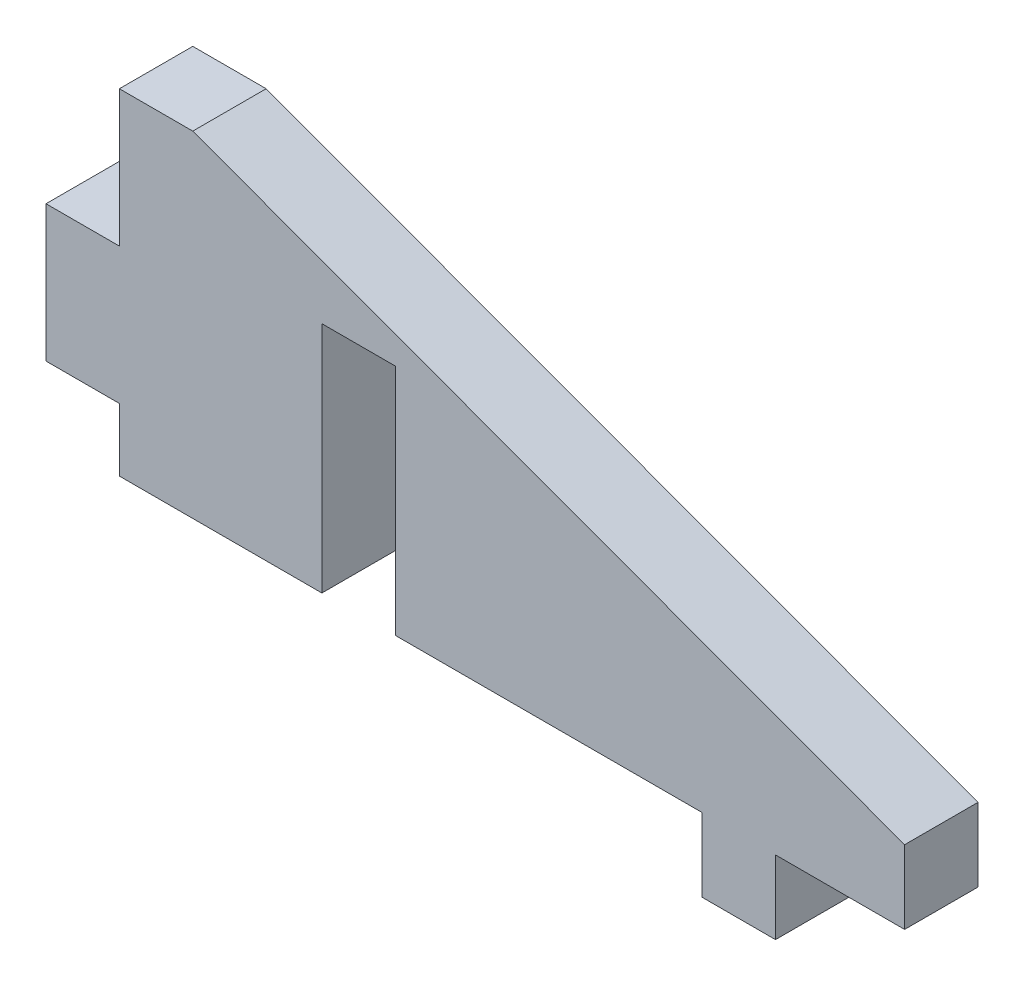
ISO-10303-21;
HEADER;
FILE_DESCRIPTION(('STEP AP214'),'2;1');
FILE_NAME('part.step','',(''),(''),'','','');
FILE_SCHEMA(('AUTOMOTIVE_DESIGN { 1 0 10303 214 1 1 1 1 }'));
ENDSEC;
DATA;
#1=APPLICATION_CONTEXT('core data for automotive mechanical design processes');
#2=APPLICATION_PROTOCOL_DEFINITION('international standard','automotive_design',2000,#1);
#3=PRODUCT_CONTEXT('',#1,'mechanical');
#4=PRODUCT('Part','Part','',(#3));
#5=PRODUCT_RELATED_PRODUCT_CATEGORY('part','',(#4));
#6=PRODUCT_DEFINITION_FORMATION('','',#4);
#7=PRODUCT_DEFINITION_CONTEXT('part definition',#1,'design');
#8=PRODUCT_DEFINITION('design','',#6,#7);
#9=PRODUCT_DEFINITION_SHAPE('','',#8);
#10=(LENGTH_UNIT() NAMED_UNIT(*) SI_UNIT(.MILLI.,.METRE.));
#11=(NAMED_UNIT(*) PLANE_ANGLE_UNIT() SI_UNIT($,.RADIAN.));
#12=(NAMED_UNIT(*) SI_UNIT($,.STERADIAN.) SOLID_ANGLE_UNIT());
#13=UNCERTAINTY_MEASURE_WITH_UNIT(LENGTH_MEASURE(1.E-05),#10,'distance_accuracy_value','');
#14=(GEOMETRIC_REPRESENTATION_CONTEXT(3) GLOBAL_UNCERTAINTY_ASSIGNED_CONTEXT((#13)) GLOBAL_UNIT_ASSIGNED_CONTEXT((#10,
#11,#12)) REPRESENTATION_CONTEXT('',''));
#15=CARTESIAN_POINT('',(0.,0.,0.));
#16=DIRECTION('',(0.,0.,1.));
#17=DIRECTION('',(1.,0.,0.));
#18=AXIS2_PLACEMENT_3D('',#15,#16,#17);
#19=CARTESIAN_POINT('',(0.,-12.7,4.5593));
#20=DIRECTION('',(0.,1.,0.));
#21=DIRECTION('',(0.,0.,1.));
#22=AXIS2_PLACEMENT_3D('',#19,#20,#21);
#23=PLANE('',#22);
#24=DIRECTION('',(0.,0.,1.));
#25=VECTOR('',#24,1.);
#26=CARTESIAN_POINT('',(18.6486799999997,-12.7,-15.6146500000006));
#27=LINE('',#26,#25);
#28=CARTESIAN_POINT('',(18.6486799999996,-12.7,-8.84708972748172E-13));
#29=VERTEX_POINT('',#28);
#30=CARTESIAN_POINT('',(18.6486799999996,-12.6999999999999,4.55929999999911));
#31=VERTEX_POINT('',#30);
#32=EDGE_CURVE('E326',#29,#31,#27,.T.);
#33=ORIENTED_EDGE('',*,*,#32,.T.);
#34=DIRECTION('',(1.,0.,0.));
#35=VECTOR('',#34,1.);
#36=CARTESIAN_POINT('',(0.,-12.7,4.5593));
#37=LINE('',#36,#35);
#38=CARTESIAN_POINT('',(14.0893799999996,-12.7,4.55929999999908));
#39=VERTEX_POINT('',#38);
#40=EDGE_CURVE('E177',#39,#31,#37,.T.);
#41=ORIENTED_EDGE('',*,*,#40,.F.);
#42=DIRECTION('',(0.,0.,1.));
#43=VECTOR('',#42,1.);
#44=CARTESIAN_POINT('',(14.0893799999997,-12.7,-15.6146500000007));
#45=LINE('',#44,#43);
#46=CARTESIAN_POINT('',(14.0893799999996,-12.7,-9.15933995315754E-13));
#47=VERTEX_POINT('',#46);
#48=EDGE_CURVE('E327',#47,#39,#45,.T.);
#49=ORIENTED_EDGE('',*,*,#48,.F.);
#50=DIRECTION('',(1.,0.,0.));
#51=VECTOR('',#50,1.);
#52=CARTESIAN_POINT('',(0.,-12.7,0.));
#53=LINE('',#52,#51);
#54=EDGE_CURVE('E232',#47,#29,#53,.T.);
#55=ORIENTED_EDGE('',*,*,#54,.T.);
#56=EDGE_LOOP('',(#33,#41,#49,#55));
#57=FACE_BOUND('',#56,.T.);
#58=ADVANCED_FACE('F35',(#57),#23,.F.);
#59=CARTESIAN_POINT('',(0.,0.,4.5593));
#60=DIRECTION('',(0.,0.,1.));
#61=DIRECTION('',(1.,0.,0.));
#62=AXIS2_PLACEMENT_3D('',#59,#60,#61);
#63=PLANE('',#62);
#64=DIRECTION('',(0.,1.,0.));
#65=VECTOR('',#64,1.);
#66=CARTESIAN_POINT('',(-4.97077999999975,0.,4.5593));
#67=LINE('',#66,#65);
#68=CARTESIAN_POINT('',(-4.97077999999975,-8.14069999999996,4.5593));
#69=VERTEX_POINT('',#68);
#70=CARTESIAN_POINT('',(-4.97077999999976,6.35000000000001,4.55929999999999));
#71=VERTEX_POINT('',#70);
#72=EDGE_CURVE('E199',#69,#71,#67,.T.);
#73=ORIENTED_EDGE('',*,*,#72,.F.);
#74=DIRECTION('',(-1.,0.,0.));
#75=VECTOR('',#74,1.);
#76=CARTESIAN_POINT('',(0.,-8.14069999999996,4.5593));
#77=LINE('',#76,#75);
#78=CARTESIAN_POINT('',(14.0893799999996,-8.14069999999995,4.55929999999908));
#79=VERTEX_POINT('',#78);
#80=EDGE_CURVE('E58',#79,#69,#77,.T.);
#81=ORIENTED_EDGE('',*,*,#80,.F.);
#82=DIRECTION('',(0.,-1.,0.));
#83=VECTOR('',#82,1.);
#84=CARTESIAN_POINT('',(14.0893799999996,-8.14069999999995,4.55929999999908));
#85=LINE('',#84,#83);
#86=EDGE_CURVE('E178',#79,#39,#85,.T.);
#87=ORIENTED_EDGE('',*,*,#86,.T.);
#88=ORIENTED_EDGE('',*,*,#40,.T.);
#89=DIRECTION('',(0.,-1.,0.));
#90=VECTOR('',#89,1.);
#91=CARTESIAN_POINT('',(18.6486799999996,-8.14069999999995,4.55929999999911));
#92=LINE('',#91,#90);
#93=CARTESIAN_POINT('',(18.6486799999996,-8.14069999999995,4.55929999999911));
#94=VERTEX_POINT('',#93);
#95=EDGE_CURVE('E167',#94,#31,#92,.T.);
#96=ORIENTED_EDGE('',*,*,#95,.F.);
#97=CARTESIAN_POINT('',(26.67,-8.14069999999995,4.5593));
#98=VERTEX_POINT('',#97);
#99=EDGE_CURVE('E155',#98,#94,#77,.T.);
#100=ORIENTED_EDGE('',*,*,#99,.F.);
#101=DIRECTION('',(0.,1.,0.));
#102=VECTOR('',#101,1.);
#103=CARTESIAN_POINT('',(26.67,0.,4.5593));
#104=LINE('',#103,#102);
#105=CARTESIAN_POINT('',(26.67,-3.5814,4.5593));
#106=VERTEX_POINT('',#105);
#107=EDGE_CURVE('E213',#98,#106,#104,.T.);
#108=ORIENTED_EDGE('',*,*,#107,.T.);
#109=DIRECTION('',(-0.938416716441645,0.345505522825442,0.));
#110=VECTOR('',#109,1.);
#111=CARTESIAN_POINT('',(2.02251562236887,5.49329126137941,4.5593));
#112=LINE('',#111,#110);
#113=CARTESIAN_POINT('',(-17.5514,12.7,4.5593));
#114=VERTEX_POINT('',#113);
#115=EDGE_CURVE('E215',#106,#114,#112,.T.);
#116=ORIENTED_EDGE('',*,*,#115,.T.);
#117=DIRECTION('',(-1.,0.,0.));
#118=VECTOR('',#117,1.);
#119=CARTESIAN_POINT('',(0.,12.7,4.5593));
#120=LINE('',#119,#118);
#121=CARTESIAN_POINT('',(-22.1107,12.7,4.5593));
#122=VERTEX_POINT('',#121);
#123=EDGE_CURVE('E217',#114,#122,#120,.T.);
#124=ORIENTED_EDGE('',*,*,#123,.T.);
#125=DIRECTION('',(0.,-1.,0.));
#126=VECTOR('',#125,1.);
#127=CARTESIAN_POINT('',(-22.1107,0.,4.5593));
#128=LINE('',#127,#126);
#129=CARTESIAN_POINT('',(-22.1107,4.23333333333333,4.5593));
#130=VERTEX_POINT('',#129);
#131=EDGE_CURVE('E219',#122,#130,#128,.T.);
#132=ORIENTED_EDGE('',*,*,#131,.T.);
#133=DIRECTION('',(1.,0.,0.));
#134=VECTOR('',#133,1.);
#135=CARTESIAN_POINT('',(0.,4.23333333333333,4.5593));
#136=LINE('',#135,#134);
#137=CARTESIAN_POINT('',(-26.67,4.23333333333333,4.5593));
#138=VERTEX_POINT('',#137);
#139=EDGE_CURVE('E221',#138,#130,#136,.T.);
#140=ORIENTED_EDGE('',*,*,#139,.F.);
#141=DIRECTION('',(0.,-1.,0.));
#142=VECTOR('',#141,1.);
#143=CARTESIAN_POINT('',(-26.67,0.,4.5593));
#144=LINE('',#143,#142);
#145=CARTESIAN_POINT('',(-26.67,-4.23333333333334,4.5593));
#146=VERTEX_POINT('',#145);
#147=EDGE_CURVE('E224',#138,#146,#144,.T.);
#148=ORIENTED_EDGE('',*,*,#147,.T.);
#149=DIRECTION('',(-1.,0.,0.));
#150=VECTOR('',#149,1.);
#151=CARTESIAN_POINT('',(0.,-4.23333333333333,4.5593));
#152=LINE('',#151,#150);
#153=CARTESIAN_POINT('',(-22.1107,-4.23333333333334,4.5593));
#154=VERTEX_POINT('',#153);
#155=EDGE_CURVE('E205',#154,#146,#152,.T.);
#156=ORIENTED_EDGE('',*,*,#155,.F.);
#157=DIRECTION('',(0.,-1.,0.));
#158=VECTOR('',#157,1.);
#159=CARTESIAN_POINT('',(-22.1107,0.,4.5593));
#160=LINE('',#159,#158);
#161=CARTESIAN_POINT('',(-22.1107,-8.14069999999996,4.5593));
#162=VERTEX_POINT('',#161);
#163=EDGE_CURVE('E208',#154,#162,#160,.T.);
#164=ORIENTED_EDGE('',*,*,#163,.T.);
#165=CARTESIAN_POINT('',(-9.53008000000039,-8.14069999999996,4.55929999999891));
#166=VERTEX_POINT('',#165);
#167=EDGE_CURVE('E164',#166,#162,#77,.T.);
#168=ORIENTED_EDGE('',*,*,#167,.F.);
#169=DIRECTION('',(0.,1.,0.));
#170=VECTOR('',#169,1.);
#171=CARTESIAN_POINT('',(-9.53007999999975,0.,4.5593));
#172=LINE('',#171,#170);
#173=CARTESIAN_POINT('',(-9.53007999999975,6.35000000000001,4.55929999999999));
#174=VERTEX_POINT('',#173);
#175=EDGE_CURVE('E194',#166,#174,#172,.T.);
#176=ORIENTED_EDGE('',*,*,#175,.T.);
#177=DIRECTION('',(-1.,0.,0.));
#178=VECTOR('',#177,1.);
#179=CARTESIAN_POINT('',(0.,6.35000000000001,4.5593));
#180=LINE('',#179,#178);
#181=EDGE_CURVE('E201',#71,#174,#180,.T.);
#182=ORIENTED_EDGE('',*,*,#181,.F.);
#183=EDGE_LOOP('',(#73,#81,#87,#88,#96,#100,#108,#116,#124,#132,#140,#148,#156,#164,#168,#176,#182));
#184=FACE_BOUND('',#183,.T.);
#185=ADVANCED_FACE('F174',(#184),#63,.T.);
#186=CARTESIAN_POINT('',(0.,-4.23333333333333,4.5593));
#187=DIRECTION('',(0.,-1.,0.));
#188=DIRECTION('',(1.,0.,0.));
#189=AXIS2_PLACEMENT_3D('',#186,#187,#188);
#190=PLANE('',#189);
#191=DIRECTION('',(-1.,0.,0.));
#192=VECTOR('',#191,1.);
#193=CARTESIAN_POINT('',(0.,-4.23333333333333,0.));
#194=LINE('',#193,#192);
#195=CARTESIAN_POINT('',(-22.1107,-4.23333333333334,0.));
#196=VERTEX_POINT('',#195);
#197=CARTESIAN_POINT('',(-26.67,-4.23333333333334,0.));
#198=VERTEX_POINT('',#197);
#199=EDGE_CURVE('E204',#196,#198,#194,.T.);
#200=ORIENTED_EDGE('',*,*,#199,.F.);
#201=DIRECTION('',(0.,0.,-1.));
#202=VECTOR('',#201,1.);
#203=CARTESIAN_POINT('',(-22.1107,-4.23333333333334,4.5593));
#204=LINE('',#203,#202);
#205=EDGE_CURVE('E263',#154,#196,#204,.T.);
#206=ORIENTED_EDGE('',*,*,#205,.F.);
#207=ORIENTED_EDGE('',*,*,#155,.T.);
#208=DIRECTION('',(0.,0.,-1.));
#209=VECTOR('',#208,1.);
#210=CARTESIAN_POINT('',(-26.67,-4.23333333333334,4.5593));
#211=LINE('',#210,#209);
#212=EDGE_CURVE('E226',#146,#198,#211,.T.);
#213=ORIENTED_EDGE('',*,*,#212,.T.);
#214=EDGE_LOOP('',(#200,#206,#207,#213));
#215=FACE_BOUND('',#214,.T.);
#216=ADVANCED_FACE('F37',(#215),#190,.T.);
#217=CARTESIAN_POINT('',(-22.1107,0.,4.5593));
#218=DIRECTION('',(1.,0.,0.));
#219=DIRECTION('',(0.,0.,-1.));
#220=AXIS2_PLACEMENT_3D('',#217,#218,#219);
#221=PLANE('',#220);
#222=DIRECTION('',(0.,-1.,0.));
#223=VECTOR('',#222,1.);
#224=CARTESIAN_POINT('',(-22.1107,0.,0.));
#225=LINE('',#224,#223);
#226=CARTESIAN_POINT('',(-22.1107000000004,-8.14069999999996,0.));
#227=VERTEX_POINT('',#226);
#228=EDGE_CURVE('E229',#196,#227,#225,.T.);
#229=ORIENTED_EDGE('',*,*,#228,.T.);
#230=DIRECTION('',(0.,0.,1.));
#231=VECTOR('',#230,1.);
#232=CARTESIAN_POINT('',(-22.1107000000003,-8.14069999999997,-15.6146500000009));
#233=LINE('',#232,#231);
#234=EDGE_CURVE('E170',#227,#162,#233,.T.);
#235=ORIENTED_EDGE('',*,*,#234,.T.);
#236=ORIENTED_EDGE('',*,*,#163,.F.);
#237=ORIENTED_EDGE('',*,*,#205,.T.);
#238=EDGE_LOOP('',(#229,#235,#236,#237));
#239=FACE_BOUND('',#238,.T.);
#240=ADVANCED_FACE('F292',(#239),#221,.F.);
#241=CARTESIAN_POINT('',(26.67,0.,4.5593));
#242=DIRECTION('',(-1.,0.,0.));
#243=DIRECTION('',(0.,0.,1.));
#244=AXIS2_PLACEMENT_3D('',#241,#242,#243);
#245=PLANE('',#244);
#246=ORIENTED_EDGE('',*,*,#107,.F.);
#247=DIRECTION('',(0.,0.,-1.));
#248=VECTOR('',#247,1.);
#249=CARTESIAN_POINT('',(26.67,-8.14069999999995,4.5593));
#250=LINE('',#249,#248);
#251=CARTESIAN_POINT('',(26.67,-8.14069999999995,0.));
#252=VERTEX_POINT('',#251);
#253=EDGE_CURVE('E160',#98,#252,#250,.T.);
#254=ORIENTED_EDGE('',*,*,#253,.T.);
#255=DIRECTION('',(0.,1.,0.));
#256=VECTOR('',#255,1.);
#257=CARTESIAN_POINT('',(26.67,0.,0.));
#258=LINE('',#257,#256);
#259=CARTESIAN_POINT('',(26.67,-3.5814,0.));
#260=VERTEX_POINT('',#259);
#261=EDGE_CURVE('E235',#252,#260,#258,.T.);
#262=ORIENTED_EDGE('',*,*,#261,.T.);
#263=DIRECTION('',(0.,0.,-1.));
#264=VECTOR('',#263,1.);
#265=CARTESIAN_POINT('',(26.67,-3.5814,4.5593));
#266=LINE('',#265,#264);
#267=EDGE_CURVE('E260',#106,#260,#266,.T.);
#268=ORIENTED_EDGE('',*,*,#267,.F.);
#269=EDGE_LOOP('',(#246,#254,#262,#268));
#270=FACE_BOUND('',#269,.T.);
#271=ADVANCED_FACE('F322',(#270),#245,.F.);
#272=CARTESIAN_POINT('',(2.02251562236887,5.49329126137941,4.5593));
#273=DIRECTION('',(-0.345505522825442,-0.938416716441645,0.));
#274=DIRECTION('',(0.938416716441645,-0.345505522825442,0.));
#275=AXIS2_PLACEMENT_3D('',#272,#273,#274);
#276=PLANE('',#275);
#277=DIRECTION('',(-0.938416716441645,0.345505522825442,0.));
#278=VECTOR('',#277,1.);
#279=CARTESIAN_POINT('',(2.02251562236887,5.49329126137941,0.));
#280=LINE('',#279,#278);
#281=CARTESIAN_POINT('',(-17.5514,12.7,0.));
#282=VERTEX_POINT('',#281);
#283=EDGE_CURVE('E237',#260,#282,#280,.T.);
#284=ORIENTED_EDGE('',*,*,#283,.T.);
#285=DIRECTION('',(0.,0.,-1.));
#286=VECTOR('',#285,1.);
#287=CARTESIAN_POINT('',(-17.5514,12.7,4.5593));
#288=LINE('',#287,#286);
#289=EDGE_CURVE('E257',#114,#282,#288,.T.);
#290=ORIENTED_EDGE('',*,*,#289,.F.);
#291=ORIENTED_EDGE('',*,*,#115,.F.);
#292=ORIENTED_EDGE('',*,*,#267,.T.);
#293=EDGE_LOOP('',(#284,#290,#291,#292));
#294=FACE_BOUND('',#293,.T.);
#295=ADVANCED_FACE('F319',(#294),#276,.F.);
#296=CARTESIAN_POINT('',(0.,12.7,4.5593));
#297=DIRECTION('',(0.,-1.,0.));
#298=DIRECTION('',(1.,0.,0.));
#299=AXIS2_PLACEMENT_3D('',#296,#297,#298);
#300=PLANE('',#299);
#301=DIRECTION('',(-1.,0.,0.));
#302=VECTOR('',#301,1.);
#303=CARTESIAN_POINT('',(0.,12.7,0.));
#304=LINE('',#303,#302);
#305=CARTESIAN_POINT('',(-22.1107,12.7,0.));
#306=VERTEX_POINT('',#305);
#307=EDGE_CURVE('E239',#282,#306,#304,.T.);
#308=ORIENTED_EDGE('',*,*,#307,.T.);
#309=DIRECTION('',(0.,0.,-1.));
#310=VECTOR('',#309,1.);
#311=CARTESIAN_POINT('',(-22.1107,12.7,4.5593));
#312=LINE('',#311,#310);
#313=EDGE_CURVE('E254',#122,#306,#312,.T.);
#314=ORIENTED_EDGE('',*,*,#313,.F.);
#315=ORIENTED_EDGE('',*,*,#123,.F.);
#316=ORIENTED_EDGE('',*,*,#289,.T.);
#317=EDGE_LOOP('',(#308,#314,#315,#316));
#318=FACE_BOUND('',#317,.T.);
#319=ADVANCED_FACE('F314',(#318),#300,.F.);
#320=CARTESIAN_POINT('',(-22.1107,0.,4.5593));
#321=DIRECTION('',(1.,0.,0.));
#322=DIRECTION('',(0.,0.,-1.));
#323=AXIS2_PLACEMENT_3D('',#320,#321,#322);
#324=PLANE('',#323);
#325=DIRECTION('',(0.,-1.,0.));
#326=VECTOR('',#325,1.);
#327=CARTESIAN_POINT('',(-22.1107,0.,0.));
#328=LINE('',#327,#326);
#329=CARTESIAN_POINT('',(-22.1107,4.23333333333333,0.));
#330=VERTEX_POINT('',#329);
#331=EDGE_CURVE('E241',#306,#330,#328,.T.);
#332=ORIENTED_EDGE('',*,*,#331,.T.);
#333=DIRECTION('',(0.,0.,-1.));
#334=VECTOR('',#333,1.);
#335=CARTESIAN_POINT('',(-22.1107,4.23333333333333,4.5593));
#336=LINE('',#335,#334);
#337=EDGE_CURVE('E252',#130,#330,#336,.T.);
#338=ORIENTED_EDGE('',*,*,#337,.F.);
#339=ORIENTED_EDGE('',*,*,#131,.F.);
#340=ORIENTED_EDGE('',*,*,#313,.T.);
#341=EDGE_LOOP('',(#332,#338,#339,#340));
#342=FACE_BOUND('',#341,.T.);
#343=ADVANCED_FACE('F309',(#342),#324,.F.);
#344=CARTESIAN_POINT('',(0.,4.23333333333333,4.5593));
#345=DIRECTION('',(0.,1.,0.));
#346=DIRECTION('',(0.,0.,1.));
#347=AXIS2_PLACEMENT_3D('',#344,#345,#346);
#348=PLANE('',#347);
#349=DIRECTION('',(1.,0.,0.));
#350=VECTOR('',#349,1.);
#351=CARTESIAN_POINT('',(0.,4.23333333333333,0.));
#352=LINE('',#351,#350);
#353=CARTESIAN_POINT('',(-26.67,4.23333333333333,0.));
#354=VERTEX_POINT('',#353);
#355=EDGE_CURVE('E244',#354,#330,#352,.T.);
#356=ORIENTED_EDGE('',*,*,#355,.F.);
#357=DIRECTION('',(0.,0.,-1.));
#358=VECTOR('',#357,1.);
#359=CARTESIAN_POINT('',(-26.67,4.23333333333333,4.5593));
#360=LINE('',#359,#358);
#361=EDGE_CURVE('E250',#138,#354,#360,.T.);
#362=ORIENTED_EDGE('',*,*,#361,.F.);
#363=ORIENTED_EDGE('',*,*,#139,.T.);
#364=ORIENTED_EDGE('',*,*,#337,.T.);
#365=EDGE_LOOP('',(#356,#362,#363,#364));
#366=FACE_BOUND('',#365,.T.);
#367=ADVANCED_FACE('F303',(#366),#348,.T.);
#368=CARTESIAN_POINT('',(-26.67,0.,4.5593));
#369=DIRECTION('',(1.,0.,0.));
#370=DIRECTION('',(0.,1.,0.));
#371=AXIS2_PLACEMENT_3D('',#368,#369,#370);
#372=PLANE('',#371);
#373=DIRECTION('',(0.,-1.,0.));
#374=VECTOR('',#373,1.);
#375=CARTESIAN_POINT('',(-26.67,0.,0.));
#376=LINE('',#375,#374);
#377=EDGE_CURVE('E209',#354,#198,#376,.T.);
#378=ORIENTED_EDGE('',*,*,#377,.T.);
#379=ORIENTED_EDGE('',*,*,#212,.F.);
#380=ORIENTED_EDGE('',*,*,#147,.F.);
#381=ORIENTED_EDGE('',*,*,#361,.T.);
#382=EDGE_LOOP('',(#378,#379,#380,#381));
#383=FACE_BOUND('',#382,.T.);
#384=ADVANCED_FACE('F412',(#383),#372,.F.);
#385=CARTESIAN_POINT('',(0.,0.,0.));
#386=DIRECTION('',(0.,0.,1.));
#387=DIRECTION('',(1.,0.,0.));
#388=AXIS2_PLACEMENT_3D('',#385,#386,#387);
#389=PLANE('',#388);
#390=ORIENTED_EDGE('',*,*,#261,.F.);
#391=DIRECTION('',(-1.,0.,0.));
#392=VECTOR('',#391,1.);
#393=CARTESIAN_POINT('',(0.,-8.14069999999996,0.));
#394=LINE('',#393,#392);
#395=CARTESIAN_POINT('',(18.6486799999996,-8.14069999999995,0.));
#396=VERTEX_POINT('',#395);
#397=EDGE_CURVE('E189',#252,#396,#394,.T.);
#398=ORIENTED_EDGE('',*,*,#397,.T.);
#399=DIRECTION('',(0.,-1.,0.));
#400=VECTOR('',#399,1.);
#401=CARTESIAN_POINT('',(18.6486799999996,-8.14069999999995,-8.86443696224148E-13));
#402=LINE('',#401,#400);
#403=EDGE_CURVE('E50',#396,#29,#402,.T.);
#404=ORIENTED_EDGE('',*,*,#403,.T.);
#405=ORIENTED_EDGE('',*,*,#54,.F.);
#406=DIRECTION('',(0.,-1.,0.));
#407=VECTOR('',#406,1.);
#408=CARTESIAN_POINT('',(14.0893799999996,-8.14069999999995,-9.17668718791731E-13));
#409=LINE('',#408,#407);
#410=CARTESIAN_POINT('',(14.0893799999996,-8.14069999999995,-9.17668718791731E-13));
#411=VERTEX_POINT('',#410);
#412=EDGE_CURVE('E182',#411,#47,#409,.T.);
#413=ORIENTED_EDGE('',*,*,#412,.F.);
#414=CARTESIAN_POINT('',(-4.97078000000037,-8.14069999999996,-1.04603825601401E-12));
#415=VERTEX_POINT('',#414);
#416=EDGE_CURVE('E188',#411,#415,#394,.T.);
#417=ORIENTED_EDGE('',*,*,#416,.T.);
#418=DIRECTION('',(0.,1.,0.));
#419=VECTOR('',#418,1.);
#420=CARTESIAN_POINT('',(-4.97077999999977,0.,0.));
#421=LINE('',#420,#419);
#422=CARTESIAN_POINT('',(-4.97077999999977,6.35,0.));
#423=VERTEX_POINT('',#422);
#424=EDGE_CURVE('E43',#415,#423,#421,.T.);
#425=ORIENTED_EDGE('',*,*,#424,.T.);
#426=DIRECTION('',(-1.,0.,0.));
#427=VECTOR('',#426,1.);
#428=CARTESIAN_POINT('',(0.,6.35000000000001,0.));
#429=LINE('',#428,#427);
#430=CARTESIAN_POINT('',(-9.53007999999977,6.35,0.));
#431=VERTEX_POINT('',#430);
#432=EDGE_CURVE('E11',#423,#431,#429,.T.);
#433=ORIENTED_EDGE('',*,*,#432,.T.);
#434=DIRECTION('',(0.,1.,0.));
#435=VECTOR('',#434,1.);
#436=CARTESIAN_POINT('',(-9.53007999999977,0.,0.));
#437=LINE('',#436,#435);
#438=CARTESIAN_POINT('',(-9.53007999999977,-8.14069999999996,0.));
#439=VERTEX_POINT('',#438);
#440=EDGE_CURVE('E265',#439,#431,#437,.T.);
#441=ORIENTED_EDGE('',*,*,#440,.F.);
#442=EDGE_CURVE('E180',#439,#227,#394,.T.);
#443=ORIENTED_EDGE('',*,*,#442,.T.);
#444=ORIENTED_EDGE('',*,*,#228,.F.);
#445=ORIENTED_EDGE('',*,*,#199,.T.);
#446=ORIENTED_EDGE('',*,*,#377,.F.);
#447=ORIENTED_EDGE('',*,*,#355,.T.);
#448=ORIENTED_EDGE('',*,*,#331,.F.);
#449=ORIENTED_EDGE('',*,*,#307,.F.);
#450=ORIENTED_EDGE('',*,*,#283,.F.);
#451=EDGE_LOOP('',(#390,#398,#404,#405,#413,#417,#425,#433,#441,#443,#444,#445,#446,#447,#448,
#449,#450));
#452=FACE_BOUND('',#451,.T.);
#453=ADVANCED_FACE('F271',(#452),#389,.F.);
#454=CARTESIAN_POINT('',(-4.97077999999983,6.35,-15.6146500000001));
#455=DIRECTION('',(0.,1.,0.));
#456=DIRECTION('',(1.,0.,0.));
#457=AXIS2_PLACEMENT_3D('',#454,#455,#456);
#458=PLANE('',#457);
#459=ORIENTED_EDGE('',*,*,#181,.T.);
#460=DIRECTION('',(0.,0.,-1.));
#461=VECTOR('',#460,1.);
#462=CARTESIAN_POINT('',(-9.53007999999983,6.35,-15.6146500000001));
#463=LINE('',#462,#461);
#464=EDGE_CURVE('E195',#174,#431,#463,.T.);
#465=ORIENTED_EDGE('',*,*,#464,.T.);
#466=ORIENTED_EDGE('',*,*,#432,.F.);
#467=DIRECTION('',(0.,0.,-1.));
#468=VECTOR('',#467,1.);
#469=CARTESIAN_POINT('',(-4.97077999999983,6.35,-15.6146500000001));
#470=LINE('',#469,#468);
#471=EDGE_CURVE('E191',#71,#423,#470,.T.);
#472=ORIENTED_EDGE('',*,*,#471,.F.);
#473=EDGE_LOOP('',(#459,#465,#466,#472));
#474=FACE_BOUND('',#473,.T.);
#475=ADVANCED_FACE('F277',(#474),#458,.F.);
#476=CARTESIAN_POINT('',(-4.97077999999983,-3.17500000000001,-15.6146500000001));
#477=DIRECTION('',(1.,0.,0.));
#478=DIRECTION('',(0.,0.,-1.));
#479=AXIS2_PLACEMENT_3D('',#476,#477,#478);
#480=PLANE('',#479);
#481=ORIENTED_EDGE('',*,*,#424,.F.);
#482=DIRECTION('',(0.,0.,1.));
#483=VECTOR('',#482,1.);
#484=CARTESIAN_POINT('',(-4.97078000000027,-8.14069999999996,-15.6146500000008));
#485=LINE('',#484,#483);
#486=EDGE_CURVE('E281',#415,#69,#485,.T.);
#487=ORIENTED_EDGE('',*,*,#486,.T.);
#488=ORIENTED_EDGE('',*,*,#72,.T.);
#489=ORIENTED_EDGE('',*,*,#471,.T.);
#490=EDGE_LOOP('',(#481,#487,#488,#489));
#491=FACE_BOUND('',#490,.T.);
#492=ADVANCED_FACE('F280',(#491),#480,.F.);
#493=CARTESIAN_POINT('',(-9.53007999999983,-3.17500000000001,-15.6146500000001));
#494=DIRECTION('',(1.,0.,0.));
#495=DIRECTION('',(0.,0.,-1.));
#496=AXIS2_PLACEMENT_3D('',#493,#494,#495);
#497=PLANE('',#496);
#498=DIRECTION('',(0.,0.,1.));
#499=VECTOR('',#498,1.);
#500=CARTESIAN_POINT('',(-9.53008000000026,-8.14069999999997,-15.6146500000008));
#501=LINE('',#500,#499);
#502=EDGE_CURVE('E287',#439,#166,#501,.T.);
#503=ORIENTED_EDGE('',*,*,#502,.F.);
#504=ORIENTED_EDGE('',*,*,#440,.T.);
#505=ORIENTED_EDGE('',*,*,#464,.F.);
#506=ORIENTED_EDGE('',*,*,#175,.F.);
#507=EDGE_LOOP('',(#503,#504,#505,#506));
#508=FACE_BOUND('',#507,.T.);
#509=ADVANCED_FACE('F286',(#508),#497,.T.);
#510=CARTESIAN_POINT('',(4.55929999999997,-8.14069999999996,-15.6146500000008));
#511=DIRECTION('',(0.,1.,0.));
#512=DIRECTION('',(0.,0.,-1.));
#513=AXIS2_PLACEMENT_3D('',#510,#511,#512);
#514=PLANE('',#513);
#515=ORIENTED_EDGE('',*,*,#234,.F.);
#516=ORIENTED_EDGE('',*,*,#442,.F.);
#517=ORIENTED_EDGE('',*,*,#502,.T.);
#518=ORIENTED_EDGE('',*,*,#167,.T.);
#519=EDGE_LOOP('',(#515,#516,#517,#518));
#520=FACE_BOUND('',#519,.T.);
#521=ADVANCED_FACE('F345',(#520),#514,.F.);
#522=ORIENTED_EDGE('',*,*,#80,.T.);
#523=ORIENTED_EDGE('',*,*,#486,.F.);
#524=ORIENTED_EDGE('',*,*,#416,.F.);
#525=DIRECTION('',(0.,0.,1.));
#526=VECTOR('',#525,1.);
#527=CARTESIAN_POINT('',(14.0893799999997,-8.14069999999996,-15.6146500000007));
#528=LINE('',#527,#526);
#529=EDGE_CURVE('E169',#411,#79,#528,.T.);
#530=ORIENTED_EDGE('',*,*,#529,.T.);
#531=EDGE_LOOP('',(#522,#523,#524,#530));
#532=FACE_BOUND('',#531,.T.);
#533=ADVANCED_FACE('F336',(#532),#514,.F.);
#534=CARTESIAN_POINT('',(14.0893799999997,-8.14069999999996,-15.6146500000007));
#535=DIRECTION('',(1.,0.,0.));
#536=DIRECTION('',(0.,0.,-1.));
#537=AXIS2_PLACEMENT_3D('',#534,#535,#536);
#538=PLANE('',#537);
#539=ORIENTED_EDGE('',*,*,#48,.T.);
#540=ORIENTED_EDGE('',*,*,#86,.F.);
#541=ORIENTED_EDGE('',*,*,#529,.F.);
#542=ORIENTED_EDGE('',*,*,#412,.T.);
#543=EDGE_LOOP('',(#539,#540,#541,#542));
#544=FACE_BOUND('',#543,.T.);
#545=ADVANCED_FACE('F337',(#544),#538,.F.);
#546=CARTESIAN_POINT('',(18.6486799999997,-8.14069999999996,-15.6146500000007));
#547=DIRECTION('',(1.,0.,0.));
#548=DIRECTION('',(0.,0.,-1.));
#549=AXIS2_PLACEMENT_3D('',#546,#547,#548);
#550=PLANE('',#549);
#551=ORIENTED_EDGE('',*,*,#32,.F.);
#552=ORIENTED_EDGE('',*,*,#403,.F.);
#553=DIRECTION('',(0.,0.,1.));
#554=VECTOR('',#553,1.);
#555=CARTESIAN_POINT('',(18.6486799999997,-8.14069999999996,-15.6146500000007));
#556=LINE('',#555,#554);
#557=EDGE_CURVE('E157',#396,#94,#556,.T.);
#558=ORIENTED_EDGE('',*,*,#557,.T.);
#559=ORIENTED_EDGE('',*,*,#95,.T.);
#560=EDGE_LOOP('',(#551,#552,#558,#559));
#561=FACE_BOUND('',#560,.T.);
#562=ADVANCED_FACE('F166',(#561),#550,.T.);
#563=ORIENTED_EDGE('',*,*,#99,.T.);
#564=ORIENTED_EDGE('',*,*,#557,.F.);
#565=ORIENTED_EDGE('',*,*,#397,.F.);
#566=ORIENTED_EDGE('',*,*,#253,.F.);
#567=EDGE_LOOP('',(#563,#564,#565,#566));
#568=FACE_BOUND('',#567,.T.);
#569=ADVANCED_FACE('F156',(#568),#514,.F.);
#570=CLOSED_SHELL('',(#58,#185,#216,#240,#271,#295,#319,#343,#367,#384,#453,#475,#492,#509,#521,
#533,#545,#562,#569));
#571=MANIFOLD_SOLID_BREP('B2',#570);
#572=ADVANCED_BREP_SHAPE_REPRESENTATION('',(#18,#571),#14);
#573=SHAPE_DEFINITION_REPRESENTATION(#9,#572);
ENDSEC;
END-ISO-10303-21;
